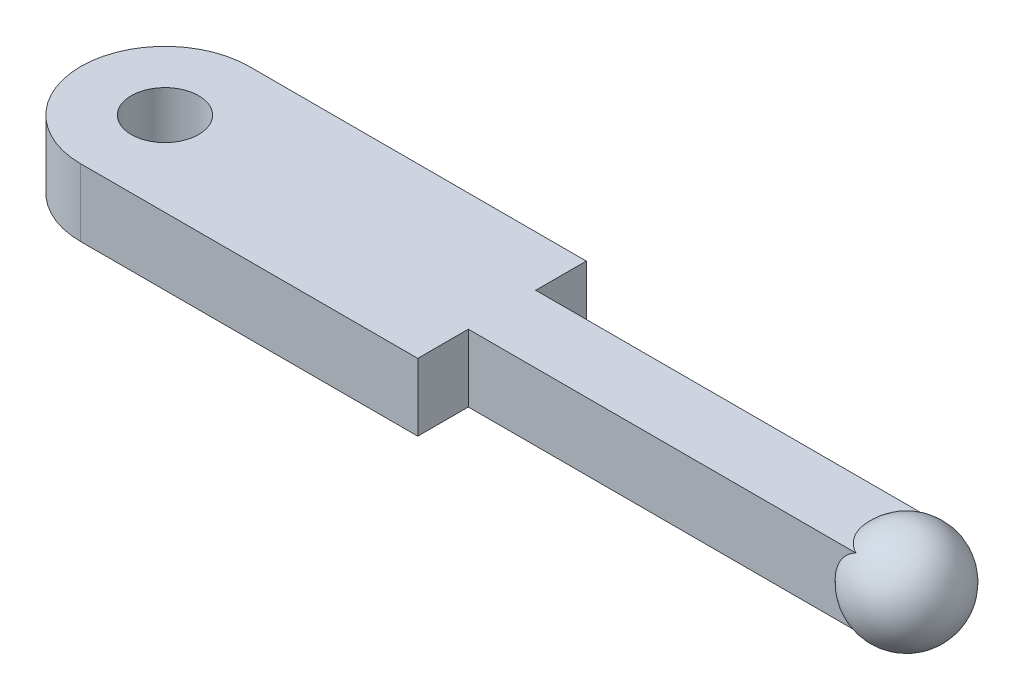
ISO-10303-21;
HEADER;
FILE_DESCRIPTION(('STEP AP214'),'2;1');
FILE_NAME('part.step','',(''),(''),'','','');
FILE_SCHEMA(('AUTOMOTIVE_DESIGN { 1 0 10303 214 1 1 1 1 }'));
ENDSEC;
DATA;
#1=APPLICATION_CONTEXT('core data for automotive mechanical design processes');
#2=APPLICATION_PROTOCOL_DEFINITION('international standard','automotive_design',2000,#1);
#3=PRODUCT_CONTEXT('',#1,'mechanical');
#4=PRODUCT('Part','Part','',(#3));
#5=PRODUCT_RELATED_PRODUCT_CATEGORY('part','',(#4));
#6=PRODUCT_DEFINITION_FORMATION('','',#4);
#7=PRODUCT_DEFINITION_CONTEXT('part definition',#1,'design');
#8=PRODUCT_DEFINITION('design','',#6,#7);
#9=PRODUCT_DEFINITION_SHAPE('','',#8);
#10=(LENGTH_UNIT() NAMED_UNIT(*) SI_UNIT(.MILLI.,.METRE.));
#11=(NAMED_UNIT(*) PLANE_ANGLE_UNIT() SI_UNIT($,.RADIAN.));
#12=(NAMED_UNIT(*) SI_UNIT($,.STERADIAN.) SOLID_ANGLE_UNIT());
#13=UNCERTAINTY_MEASURE_WITH_UNIT(LENGTH_MEASURE(1.E-05),#10,'distance_accuracy_value','');
#14=(GEOMETRIC_REPRESENTATION_CONTEXT(3) GLOBAL_UNCERTAINTY_ASSIGNED_CONTEXT((#13)) GLOBAL_UNIT_ASSIGNED_CONTEXT((#10,
#11,#12)) REPRESENTATION_CONTEXT('',''));
#15=CARTESIAN_POINT('',(0.,0.,0.));
#16=DIRECTION('',(0.,0.,1.));
#17=DIRECTION('',(1.,0.,0.));
#18=AXIS2_PLACEMENT_3D('',#15,#16,#17);
#19=CARTESIAN_POINT('',(0.,2.,-2.5));
#20=DIRECTION('',(-1.,0.,0.));
#21=DIRECTION('',(0.,0.,1.));
#22=AXIS2_PLACEMENT_3D('',#19,#20,#21);
#23=PLANE('',#22);
#24=DIRECTION('',(0.,1.,0.));
#25=VECTOR('',#24,1.);
#26=CARTESIAN_POINT('',(0.,2.,-1.));
#27=LINE('',#26,#25);
#28=CARTESIAN_POINT('',(0.,0.,-1.));
#29=VERTEX_POINT('',#28);
#30=CARTESIAN_POINT('',(0.,2.,-1.));
#31=VERTEX_POINT('',#30);
#32=EDGE_CURVE('E123',#29,#31,#27,.T.);
#33=ORIENTED_EDGE('',*,*,#32,.F.);
#34=DIRECTION('',(0.,0.,-1.));
#35=VECTOR('',#34,1.);
#36=CARTESIAN_POINT('',(0.,0.,-2.5));
#37=LINE('',#36,#35);
#38=CARTESIAN_POINT('',(0.,0.,-2.5));
#39=VERTEX_POINT('',#38);
#40=EDGE_CURVE('E157',#29,#39,#37,.T.);
#41=ORIENTED_EDGE('',*,*,#40,.T.);
#42=DIRECTION('',(0.,-1.,0.));
#43=VECTOR('',#42,1.);
#44=CARTESIAN_POINT('',(0.,2.,-2.5));
#45=LINE('',#44,#43);
#46=CARTESIAN_POINT('',(0.,2.,-2.5));
#47=VERTEX_POINT('',#46);
#48=EDGE_CURVE('E163',#47,#39,#45,.T.);
#49=ORIENTED_EDGE('',*,*,#48,.F.);
#50=DIRECTION('',(0.,0.,-1.));
#51=VECTOR('',#50,1.);
#52=CARTESIAN_POINT('',(0.,2.,-2.5));
#53=LINE('',#52,#51);
#54=EDGE_CURVE('E146',#31,#47,#53,.T.);
#55=ORIENTED_EDGE('',*,*,#54,.F.);
#56=EDGE_LOOP('',(#33,#41,#49,#55));
#57=FACE_BOUND('',#56,.T.);
#58=ADVANCED_FACE('F38',(#57),#23,.F.);
#59=DIRECTION('',(0.,-1.,0.));
#60=VECTOR('',#59,1.);
#61=CARTESIAN_POINT('',(0.,2.,1.));
#62=LINE('',#61,#60);
#63=CARTESIAN_POINT('',(0.,2.,1.));
#64=VERTEX_POINT('',#63);
#65=CARTESIAN_POINT('',(0.,0.,1.));
#66=VERTEX_POINT('',#65);
#67=EDGE_CURVE('E107',#64,#66,#62,.T.);
#68=ORIENTED_EDGE('',*,*,#67,.F.);
#69=CARTESIAN_POINT('',(0.,2.,2.5));
#70=VERTEX_POINT('',#69);
#71=EDGE_CURVE('E147',#70,#64,#53,.T.);
#72=ORIENTED_EDGE('',*,*,#71,.F.);
#73=DIRECTION('',(0.,-1.,0.));
#74=VECTOR('',#73,1.);
#75=CARTESIAN_POINT('',(0.,2.,2.5));
#76=LINE('',#75,#74);
#77=CARTESIAN_POINT('',(0.,0.,2.5));
#78=VERTEX_POINT('',#77);
#79=EDGE_CURVE('E166',#70,#78,#76,.T.);
#80=ORIENTED_EDGE('',*,*,#79,.T.);
#81=EDGE_CURVE('E158',#78,#66,#37,.T.);
#82=ORIENTED_EDGE('',*,*,#81,.T.);
#83=EDGE_LOOP('',(#68,#72,#80,#82));
#84=FACE_BOUND('',#83,.T.);
#85=ADVANCED_FACE('F179',(#84),#23,.F.);
#86=CARTESIAN_POINT('',(-10.,2.,0.));
#87=DIRECTION('',(0.,1.,0.));
#88=DIRECTION('',(0.,0.,1.));
#89=AXIS2_PLACEMENT_3D('',#86,#87,#88);
#90=PLANE('',#89);
#91=DIRECTION('',(-1.,0.,0.));
#92=VECTOR('',#91,1.);
#93=CARTESIAN_POINT('',(12.,2.,1.));
#94=LINE('',#93,#92);
#95=CARTESIAN_POINT('',(11.5,2.,1.));
#96=VERTEX_POINT('',#95);
#97=EDGE_CURVE('E111',#96,#64,#94,.T.);
#98=ORIENTED_EDGE('',*,*,#97,.F.);
#99=CARTESIAN_POINT('',(12.,2.,0.));
#100=DIRECTION('',(0.,1.,0.));
#101=DIRECTION('',(0.,0.,1.));
#102=AXIS2_PLACEMENT_3D('',#99,#100,#101);
#103=CIRCLE('',#102,1.1180339887499);
#104=CARTESIAN_POINT('',(11.5,2.,-1.));
#105=VERTEX_POINT('',#104);
#106=EDGE_CURVE('E61',#96,#105,#103,.F.);
#107=ORIENTED_EDGE('',*,*,#106,.T.);
#108=DIRECTION('',(-1.,0.,0.));
#109=VECTOR('',#108,1.);
#110=CARTESIAN_POINT('',(12.,2.,-1.));
#111=LINE('',#110,#109);
#112=EDGE_CURVE('E131',#105,#31,#111,.T.);
#113=ORIENTED_EDGE('',*,*,#112,.T.);
#114=ORIENTED_EDGE('',*,*,#54,.T.);
#115=DIRECTION('',(-1.,0.,0.));
#116=VECTOR('',#115,1.);
#117=CARTESIAN_POINT('',(-10.,2.,-2.5));
#118=LINE('',#117,#116);
#119=CARTESIAN_POINT('',(-10.,2.,-2.5));
#120=VERTEX_POINT('',#119);
#121=EDGE_CURVE('E150',#47,#120,#118,.T.);
#122=ORIENTED_EDGE('',*,*,#121,.T.);
#123=CARTESIAN_POINT('',(-10.,2.,0.));
#124=DIRECTION('',(0.,1.,0.));
#125=DIRECTION('',(0.,0.,1.));
#126=AXIS2_PLACEMENT_3D('',#123,#124,#125);
#127=CIRCLE('',#126,2.5);
#128=CARTESIAN_POINT('',(-10.,2.,2.5));
#129=VERTEX_POINT('',#128);
#130=EDGE_CURVE('E140',#120,#129,#127,.T.);
#131=ORIENTED_EDGE('',*,*,#130,.T.);
#132=DIRECTION('',(1.,0.,0.));
#133=VECTOR('',#132,1.);
#134=CARTESIAN_POINT('',(-10.,2.,2.5));
#135=LINE('',#134,#133);
#136=EDGE_CURVE('E143',#129,#70,#135,.T.);
#137=ORIENTED_EDGE('',*,*,#136,.T.);
#138=ORIENTED_EDGE('',*,*,#71,.T.);
#139=EDGE_LOOP('',(#98,#107,#113,#114,#122,#131,#137,#138));
#140=FACE_BOUND('',#139,.T.);
#141=CARTESIAN_POINT('',(-10.,2.,0.));
#142=DIRECTION('',(0.,1.,0.));
#143=DIRECTION('',(0.,0.,1.));
#144=AXIS2_PLACEMENT_3D('',#141,#142,#143);
#145=CIRCLE('',#144,1.);
#146=CARTESIAN_POINT('',(-10.,2.,1.));
#147=VERTEX_POINT('',#146);
#148=EDGE_CURVE('E134',#147,#147,#145,.T.);
#149=ORIENTED_EDGE('',*,*,#148,.F.);
#150=EDGE_LOOP('',(#149));
#151=FACE_BOUND('',#150,.T.);
#152=ADVANCED_FACE('F181',(#140,#151),#90,.T.);
#153=CARTESIAN_POINT('',(-10.,0.,0.));
#154=DIRECTION('',(0.,1.,0.));
#155=DIRECTION('',(0.,0.,1.));
#156=AXIS2_PLACEMENT_3D('',#153,#154,#155);
#157=PLANE('',#156);
#158=CARTESIAN_POINT('',(12.,0.,0.));
#159=DIRECTION('',(0.,1.,0.));
#160=DIRECTION('',(0.,0.,1.));
#161=AXIS2_PLACEMENT_3D('',#158,#159,#160);
#162=CIRCLE('',#161,1.11803398874989);
#163=CARTESIAN_POINT('',(11.5,0.,1.));
#164=VERTEX_POINT('',#163);
#165=CARTESIAN_POINT('',(11.5,0.,-1.));
#166=VERTEX_POINT('',#165);
#167=EDGE_CURVE('E115',#164,#166,#162,.F.);
#168=ORIENTED_EDGE('',*,*,#167,.F.);
#169=DIRECTION('',(-1.,0.,0.));
#170=VECTOR('',#169,1.);
#171=CARTESIAN_POINT('',(12.,0.,1.));
#172=LINE('',#171,#170);
#173=EDGE_CURVE('E103',#164,#66,#172,.T.);
#174=ORIENTED_EDGE('',*,*,#173,.T.);
#175=ORIENTED_EDGE('',*,*,#81,.F.);
#176=DIRECTION('',(1.,0.,0.));
#177=VECTOR('',#176,1.);
#178=CARTESIAN_POINT('',(-10.,0.,2.5));
#179=LINE('',#178,#177);
#180=CARTESIAN_POINT('',(-10.,0.,2.5));
#181=VERTEX_POINT('',#180);
#182=EDGE_CURVE('E155',#181,#78,#179,.T.);
#183=ORIENTED_EDGE('',*,*,#182,.F.);
#184=CARTESIAN_POINT('',(-10.,0.,0.));
#185=DIRECTION('',(0.,1.,0.));
#186=DIRECTION('',(0.,0.,1.));
#187=AXIS2_PLACEMENT_3D('',#184,#185,#186);
#188=CIRCLE('',#187,2.5);
#189=CARTESIAN_POINT('',(-10.,0.,-2.5));
#190=VERTEX_POINT('',#189);
#191=EDGE_CURVE('E137',#190,#181,#188,.T.);
#192=ORIENTED_EDGE('',*,*,#191,.F.);
#193=DIRECTION('',(-1.,0.,0.));
#194=VECTOR('',#193,1.);
#195=CARTESIAN_POINT('',(-10.,0.,-2.5));
#196=LINE('',#195,#194);
#197=EDGE_CURVE('E144',#39,#190,#196,.T.);
#198=ORIENTED_EDGE('',*,*,#197,.F.);
#199=ORIENTED_EDGE('',*,*,#40,.F.);
#200=DIRECTION('',(-1.,0.,0.));
#201=VECTOR('',#200,1.);
#202=CARTESIAN_POINT('',(12.,0.,-1.));
#203=LINE('',#202,#201);
#204=EDGE_CURVE('E112',#166,#29,#203,.T.);
#205=ORIENTED_EDGE('',*,*,#204,.F.);
#206=EDGE_LOOP('',(#168,#174,#175,#183,#192,#198,#199,#205));
#207=FACE_BOUND('',#206,.T.);
#208=CARTESIAN_POINT('',(-10.,0.,0.));
#209=DIRECTION('',(0.,1.,0.));
#210=DIRECTION('',(0.,0.,1.));
#211=AXIS2_PLACEMENT_3D('',#208,#209,#210);
#212=CIRCLE('',#211,1.);
#213=CARTESIAN_POINT('',(-10.,0.,1.));
#214=VERTEX_POINT('',#213);
#215=EDGE_CURVE('E133',#214,#214,#212,.T.);
#216=ORIENTED_EDGE('',*,*,#215,.T.);
#217=EDGE_LOOP('',(#216));
#218=FACE_BOUND('',#217,.T.);
#219=ADVANCED_FACE('F116',(#207,#218),#157,.F.);
#220=CARTESIAN_POINT('',(-10.,2.,0.));
#221=DIRECTION('',(0.,-1.,0.));
#222=DIRECTION('',(0.,0.,-1.));
#223=AXIS2_PLACEMENT_3D('',#220,#221,#222);
#224=CYLINDRICAL_SURFACE('',#223,2.5);
#225=ORIENTED_EDGE('',*,*,#191,.T.);
#226=DIRECTION('',(0.,-1.,0.));
#227=VECTOR('',#226,1.);
#228=CARTESIAN_POINT('',(-10.,2.,2.5));
#229=LINE('',#228,#227);
#230=EDGE_CURVE('E46',#129,#181,#229,.T.);
#231=ORIENTED_EDGE('',*,*,#230,.F.);
#232=ORIENTED_EDGE('',*,*,#130,.F.);
#233=DIRECTION('',(0.,-1.,0.));
#234=VECTOR('',#233,1.);
#235=CARTESIAN_POINT('',(-10.,2.,-2.5));
#236=LINE('',#235,#234);
#237=EDGE_CURVE('E152',#120,#190,#236,.T.);
#238=ORIENTED_EDGE('',*,*,#237,.T.);
#239=EDGE_LOOP('',(#225,#231,#232,#238));
#240=FACE_BOUND('',#239,.T.);
#241=ADVANCED_FACE('F40',(#240),#224,.T.);
#242=CARTESIAN_POINT('',(-10.,2.,2.5));
#243=DIRECTION('',(0.,0.,-1.));
#244=DIRECTION('',(-1.,0.,0.));
#245=AXIS2_PLACEMENT_3D('',#242,#243,#244);
#246=PLANE('',#245);
#247=ORIENTED_EDGE('',*,*,#182,.T.);
#248=ORIENTED_EDGE('',*,*,#79,.F.);
#249=ORIENTED_EDGE('',*,*,#136,.F.);
#250=ORIENTED_EDGE('',*,*,#230,.T.);
#251=EDGE_LOOP('',(#247,#248,#249,#250));
#252=FACE_BOUND('',#251,.T.);
#253=ADVANCED_FACE('F171',(#252),#246,.F.);
#254=CARTESIAN_POINT('',(-10.,2.,-2.5));
#255=DIRECTION('',(0.,0.,1.));
#256=DIRECTION('',(1.,0.,0.));
#257=AXIS2_PLACEMENT_3D('',#254,#255,#256);
#258=PLANE('',#257);
#259=ORIENTED_EDGE('',*,*,#197,.T.);
#260=ORIENTED_EDGE('',*,*,#237,.F.);
#261=ORIENTED_EDGE('',*,*,#121,.F.);
#262=ORIENTED_EDGE('',*,*,#48,.T.);
#263=EDGE_LOOP('',(#259,#260,#261,#262));
#264=FACE_BOUND('',#263,.T.);
#265=ADVANCED_FACE('F187',(#264),#258,.F.);
#266=CARTESIAN_POINT('',(-10.,2.,0.));
#267=DIRECTION('',(0.,-1.,0.));
#268=DIRECTION('',(0.,0.,-1.));
#269=AXIS2_PLACEMENT_3D('',#266,#267,#268);
#270=CYLINDRICAL_SURFACE('',#269,1.);
#271=ORIENTED_EDGE('',*,*,#148,.T.);
#272=EDGE_LOOP('',(#271));
#273=FACE_BOUND('',#272,.T.);
#274=ORIENTED_EDGE('',*,*,#215,.F.);
#275=EDGE_LOOP('',(#274));
#276=FACE_BOUND('',#275,.T.);
#277=ADVANCED_FACE('F192',(#273,#276),#270,.F.);
#278=CARTESIAN_POINT('',(12.,2.,-1.));
#279=DIRECTION('',(0.,0.,1.));
#280=DIRECTION('',(0.,-1.,0.));
#281=AXIS2_PLACEMENT_3D('',#278,#279,#280);
#282=PLANE('',#281);
#283=CARTESIAN_POINT('',(12.,1.,-1.));
#284=DIRECTION('',(0.,0.,1.));
#285=DIRECTION('',(0.,-1.,0.));
#286=AXIS2_PLACEMENT_3D('',#283,#284,#285);
#287=CIRCLE('',#286,1.11803398874989);
#288=EDGE_CURVE('E53',#166,#105,#287,.F.);
#289=ORIENTED_EDGE('',*,*,#288,.F.);
#290=ORIENTED_EDGE('',*,*,#204,.T.);
#291=ORIENTED_EDGE('',*,*,#32,.T.);
#292=ORIENTED_EDGE('',*,*,#112,.F.);
#293=EDGE_LOOP('',(#289,#290,#291,#292));
#294=FACE_BOUND('',#293,.T.);
#295=ADVANCED_FACE('F190',(#294),#282,.F.);
#296=CARTESIAN_POINT('',(12.,2.,1.));
#297=DIRECTION('',(0.,0.,-1.));
#298=DIRECTION('',(0.,1.,0.));
#299=AXIS2_PLACEMENT_3D('',#296,#297,#298);
#300=PLANE('',#299);
#301=CARTESIAN_POINT('',(12.,1.,1.));
#302=DIRECTION('',(0.,0.,-1.));
#303=DIRECTION('',(0.,1.,0.));
#304=AXIS2_PLACEMENT_3D('',#301,#302,#303);
#305=CIRCLE('',#304,1.1180339887499);
#306=EDGE_CURVE('E11',#96,#164,#305,.F.);
#307=ORIENTED_EDGE('',*,*,#306,.F.);
#308=ORIENTED_EDGE('',*,*,#97,.T.);
#309=ORIENTED_EDGE('',*,*,#67,.T.);
#310=ORIENTED_EDGE('',*,*,#173,.F.);
#311=EDGE_LOOP('',(#307,#308,#309,#310));
#312=FACE_BOUND('',#311,.T.);
#313=ADVANCED_FACE('F105',(#312),#300,.F.);
#314=CARTESIAN_POINT('',(12.,1.,0.));
#315=DIRECTION('',(-1.,0.,0.));
#316=DIRECTION('',(0.,1.,0.));
#317=AXIS2_PLACEMENT_3D('',#314,#315,#316);
#318=SPHERICAL_SURFACE('',#317,1.5);
#319=ORIENTED_EDGE('',*,*,#167,.T.);
#320=ORIENTED_EDGE('',*,*,#288,.T.);
#321=ORIENTED_EDGE('',*,*,#106,.F.);
#322=ORIENTED_EDGE('',*,*,#306,.T.);
#323=EDGE_LOOP('',(#319,#320,#321,#322));
#324=FACE_BOUND('',#323,.T.);
#325=ADVANCED_FACE('F121',(#324),#318,.T.);
#326=CLOSED_SHELL('',(#58,#85,#152,#219,#241,#253,#265,#277,#295,#313,#325));
#327=MANIFOLD_SOLID_BREP('B2',#326);
#328=ADVANCED_BREP_SHAPE_REPRESENTATION('',(#18,#327),#14);
#329=SHAPE_DEFINITION_REPRESENTATION(#9,#328);
ENDSEC;
END-ISO-10303-21;
